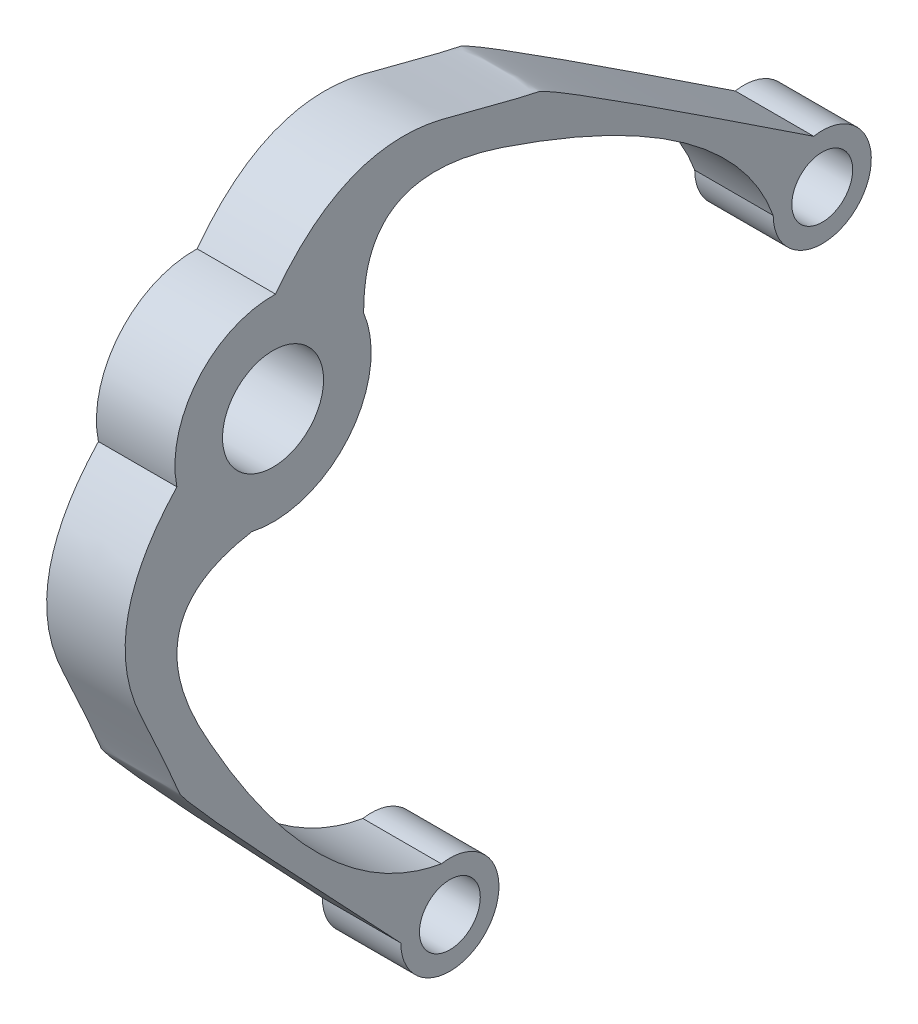
ISO-10303-21;
HEADER;
FILE_DESCRIPTION(('STEP AP214'),'2;1');
FILE_NAME('part.step','',(''),(''),'','','');
FILE_SCHEMA(('AUTOMOTIVE_DESIGN { 1 0 10303 214 1 1 1 1 }'));
ENDSEC;
DATA;
#1=APPLICATION_CONTEXT('core data for automotive mechanical design processes');
#2=APPLICATION_PROTOCOL_DEFINITION('international standard','automotive_design',2000,#1);
#3=PRODUCT_CONTEXT('',#1,'mechanical');
#4=PRODUCT('Part','Part','',(#3));
#5=PRODUCT_RELATED_PRODUCT_CATEGORY('part','',(#4));
#6=PRODUCT_DEFINITION_FORMATION('','',#4);
#7=PRODUCT_DEFINITION_CONTEXT('part definition',#1,'design');
#8=PRODUCT_DEFINITION('design','',#6,#7);
#9=PRODUCT_DEFINITION_SHAPE('','',#8);
#10=(LENGTH_UNIT() NAMED_UNIT(*) SI_UNIT(.MILLI.,.METRE.));
#11=(NAMED_UNIT(*) PLANE_ANGLE_UNIT() SI_UNIT($,.RADIAN.));
#12=(NAMED_UNIT(*) SI_UNIT($,.STERADIAN.) SOLID_ANGLE_UNIT());
#13=UNCERTAINTY_MEASURE_WITH_UNIT(LENGTH_MEASURE(1.E-05),#10,'distance_accuracy_value','');
#14=(GEOMETRIC_REPRESENTATION_CONTEXT(3) GLOBAL_UNCERTAINTY_ASSIGNED_CONTEXT((#13)) GLOBAL_UNIT_ASSIGNED_CONTEXT((#10,
#11,#12)) REPRESENTATION_CONTEXT('',''));
#15=CARTESIAN_POINT('',(0.,0.,0.));
#16=DIRECTION('',(0.,0.,1.));
#17=DIRECTION('',(1.,0.,0.));
#18=AXIS2_PLACEMENT_3D('',#15,#16,#17);
#19=CARTESIAN_POINT('',(4.,0.,0.));
#20=DIRECTION('',(-1.,0.,0.));
#21=DIRECTION('',(0.,0.,1.));
#22=AXIS2_PLACEMENT_3D('',#19,#20,#21);
#23=CYLINDRICAL_SURFACE('',#22,5.);
#24=DIRECTION('',(-1.,0.,0.));
#25=VECTOR('',#24,1.);
#26=CARTESIAN_POINT('',(4.,1.91370313241745,-4.61927919928809));
#27=LINE('',#26,#25);
#28=CARTESIAN_POINT('',(4.,1.91370313241745,-4.61927919928809));
#29=VERTEX_POINT('',#28);
#30=CARTESIAN_POINT('',(0.,1.91370313241745,-4.61927919928809));
#31=VERTEX_POINT('',#30);
#32=EDGE_CURVE('E234',#29,#31,#27,.T.);
#33=ORIENTED_EDGE('',*,*,#32,.F.);
#34=CARTESIAN_POINT('',(4.,0.,0.));
#35=DIRECTION('',(1.,0.,0.));
#36=DIRECTION('',(0.,0.,-1.));
#37=AXIS2_PLACEMENT_3D('',#34,#35,#36);
#38=CIRCLE('',#37,5.);
#39=CARTESIAN_POINT('',(4.,-4.88160145476072,1.08165023777469));
#40=VERTEX_POINT('',#39);
#41=EDGE_CURVE('E52',#40,#29,#38,.T.);
#42=ORIENTED_EDGE('',*,*,#41,.F.);
#43=DIRECTION('',(-1.,0.,0.));
#44=VECTOR('',#43,1.);
#45=CARTESIAN_POINT('',(4.,-4.88160145476072,1.08165023777469));
#46=LINE('',#45,#44);
#47=CARTESIAN_POINT('',(0.,-4.88160145476072,1.08165023777469));
#48=VERTEX_POINT('',#47);
#49=EDGE_CURVE('E427',#40,#48,#46,.T.);
#50=ORIENTED_EDGE('',*,*,#49,.T.);
#51=CARTESIAN_POINT('',(0.,0.,0.));
#52=DIRECTION('',(1.,0.,0.));
#53=DIRECTION('',(0.,0.,-1.));
#54=AXIS2_PLACEMENT_3D('',#51,#52,#53);
#55=CIRCLE('',#54,5.);
#56=EDGE_CURVE('E247',#48,#31,#55,.T.);
#57=ORIENTED_EDGE('',*,*,#56,.T.);
#58=EDGE_LOOP('',(#33,#42,#50,#57));
#59=FACE_BOUND('',#58,.T.);
#60=ADVANCED_FACE('F42',(#59),#23,.T.);
#61=CARTESIAN_POINT('',(4.,0.,0.));
#62=DIRECTION('',(1.,0.,0.));
#63=DIRECTION('',(0.,0.,-1.));
#64=AXIS2_PLACEMENT_3D('',#61,#62,#63);
#65=PLANE('',#64);
#66=CARTESIAN_POINT('',(4.,4.99836423231631,-0.127886672882471));
#67=VERTEX_POINT('',#66);
#68=CARTESIAN_POINT('',(4.,-0.994753899642719,4.90004741600993));
#69=VERTEX_POINT('',#68);
#70=EDGE_CURVE('E11',#67,#69,#38,.T.);
#71=ORIENTED_EDGE('',*,*,#70,.T.);
#72=CARTESIAN_POINT('',(4.,-26.8315889406303,-6.51178854612726));
#73=CARTESIAN_POINT('',(4.,-15.2290963006331,4.52633564030782));
#74=CARTESIAN_POINT('',(4.,-13.8179530887985,5.05001310155712));
#75=CARTESIAN_POINT('',(4.,-5.36192277327116,8.97966757300983));
#76=CARTESIAN_POINT('',(4.,-0.994753899642723,4.90004741600993));
#77=B_SPLINE_CURVE_WITH_KNOTS('',2,(#72,#73,#74,#75,#76),.UNSPECIFIED.,.F.,.F.,(3,1,1,3),(0.,
0.266874259290428,0.583686931850672,1.),.UNSPECIFIED.);
#78=CARTESIAN_POINT('',(4.,-26.8315889406303,-6.51178854612727));
#79=VERTEX_POINT('',#78);
#80=EDGE_CURVE('E136',#79,#69,#77,.T.);
#81=ORIENTED_EDGE('',*,*,#80,.F.);
#82=CARTESIAN_POINT('',(4.,-26.8315889406304,-9.01178854612727));
#83=DIRECTION('',(-1.,0.,0.));
#84=DIRECTION('',(0.,0.,-1.));
#85=AXIS2_PLACEMENT_3D('',#82,#83,#84);
#86=CIRCLE('',#85,2.5);
#87=CARTESIAN_POINT('',(4.,-24.3696451898903,-8.57723939103412));
#88=VERTEX_POINT('',#87);
#89=EDGE_CURVE('E114',#88,#79,#86,.T.);
#90=ORIENTED_EDGE('',*,*,#89,.F.);
#91=CARTESIAN_POINT('',(4.,-4.88160145476072,1.08165023777469));
#92=CARTESIAN_POINT('',(4.,-5.90310291285958,7.19587697461945));
#93=CARTESIAN_POINT('',(4.,-23.3016006741901,-2.35303446189858));
#94=CARTESIAN_POINT('',(4.,-24.3696451898903,-8.57723939103412));
#95=B_SPLINE_CURVE_WITH_KNOTS('',2,(#91,#92,#93,#94),.UNSPECIFIED.,.F.,.F.,(3,1,3),(0.,
0.386205631183094,1.),.UNSPECIFIED.);
#96=EDGE_CURVE('E141',#40,#88,#95,.T.);
#97=ORIENTED_EDGE('',*,*,#96,.F.);
#98=ORIENTED_EDGE('',*,*,#41,.T.);
#99=CARTESIAN_POINT('',(4.,-4.21074887606834,-25.4895711253631));
#100=CARTESIAN_POINT('',(4.,1.73306095861607,-23.3558957197539));
#101=CARTESIAN_POINT('',(4.,8.11241309278775,-4.56245802672587));
#102=CARTESIAN_POINT('',(4.,1.91370313241745,-4.61927919928809));
#103=B_SPLINE_CURVE_WITH_KNOTS('',2,(#99,#100,#101,#102),.UNSPECIFIED.,.F.,.F.,(3,1,3),(0.,
0.613794368816906,1.),.UNSPECIFIED.);
#104=CARTESIAN_POINT('',(4.,-4.21074887606834,-25.4895711253631));
#105=VERTEX_POINT('',#104);
#106=EDGE_CURVE('E193',#105,#29,#103,.T.);
#107=ORIENTED_EDGE('',*,*,#106,.F.);
#108=CARTESIAN_POINT('',(4.,-4.21074887606834,-27.9895711253631));
#109=DIRECTION('',(-1.,0.,0.));
#110=DIRECTION('',(0.,0.,1.));
#111=AXIS2_PLACEMENT_3D('',#108,#109,#110);
#112=CIRCLE('',#111,2.5);
#113=CARTESIAN_POINT('',(4.,-1.74880512532834,-27.5550219702698));
#114=VERTEX_POINT('',#113);
#115=EDGE_CURVE('E202',#114,#105,#112,.T.);
#116=ORIENTED_EDGE('',*,*,#115,.F.);
#117=CARTESIAN_POINT('',(4.,4.99836423231631,-0.127886672882471));
#118=CARTESIAN_POINT('',(4.,9.77498219035762,-3.7194581226947));
#119=CARTESIAN_POINT('',(4.,7.37497121455518,-12.7298177313981));
#120=CARTESIAN_POINT('',(4.,7.10454986947199,-14.2105052554391));
#121=CARTESIAN_POINT('',(4.,-1.74880512532834,-27.5550219702698));
#122=B_SPLINE_CURVE_WITH_KNOTS('',2,(#117,#118,#119,#120,#121),.UNSPECIFIED.,.F.,.F.,(3,1,1,3),
(0.,0.416313068149328,0.733125740709572,1.),.UNSPECIFIED.);
#123=EDGE_CURVE('E226',#67,#114,#122,.T.);
#124=ORIENTED_EDGE('',*,*,#123,.F.);
#125=EDGE_LOOP('',(#71,#81,#90,#97,#98,#107,#116,#124));
#126=FACE_BOUND('',#125,.T.);
#127=CARTESIAN_POINT('',(4.,0.,0.));
#128=DIRECTION('',(1.,0.,0.));
#129=DIRECTION('',(0.,0.,-1.));
#130=AXIS2_PLACEMENT_3D('',#127,#128,#129);
#131=CIRCLE('',#130,2.575);
#132=CARTESIAN_POINT('',(4.,0.,-2.575));
#133=VERTEX_POINT('',#132);
#134=EDGE_CURVE('E243',#133,#133,#131,.T.);
#135=ORIENTED_EDGE('',*,*,#134,.F.);
#136=EDGE_LOOP('',(#135));
#137=FACE_BOUND('',#136,.T.);
#138=CARTESIAN_POINT('',(4.,-4.21074887606834,-27.9895711253631));
#139=DIRECTION('',(-1.,0.,0.));
#140=DIRECTION('',(0.,0.,1.));
#141=AXIS2_PLACEMENT_3D('',#138,#139,#140);
#142=CIRCLE('',#141,1.55000000001448);
#143=CARTESIAN_POINT('',(4.,-4.21074887606834,-26.4395711253486));
#144=VERTEX_POINT('',#143);
#145=EDGE_CURVE('E214',#144,#144,#142,.T.);
#146=ORIENTED_EDGE('',*,*,#145,.T.);
#147=EDGE_LOOP('',(#146));
#148=FACE_BOUND('',#147,.T.);
#149=CARTESIAN_POINT('',(4.,-26.8315889406304,-9.01178854612727));
#150=DIRECTION('',(-1.,0.,0.));
#151=DIRECTION('',(0.,0.,-1.));
#152=AXIS2_PLACEMENT_3D('',#149,#150,#151);
#153=CIRCLE('',#152,1.54999999999715);
#154=CARTESIAN_POINT('',(4.,-26.8315889406304,-10.5617885461244));
#155=VERTEX_POINT('',#154);
#156=EDGE_CURVE('E127',#155,#155,#153,.T.);
#157=ORIENTED_EDGE('',*,*,#156,.T.);
#158=EDGE_LOOP('',(#157));
#159=FACE_BOUND('',#158,.T.);
#160=ADVANCED_FACE('F264',(#126,#137,#148,#159),#65,.T.);
#161=CARTESIAN_POINT('',(0.,0.,0.));
#162=DIRECTION('',(1.,0.,0.));
#163=DIRECTION('',(0.,0.,-1.));
#164=AXIS2_PLACEMENT_3D('',#161,#162,#163);
#165=PLANE('',#164);
#166=CARTESIAN_POINT('',(0.,-4.21074887606834,-25.4895711253631));
#167=CARTESIAN_POINT('',(0.,1.73306095861607,-23.3558957197539));
#168=CARTESIAN_POINT('',(0.,8.11241309278775,-4.56245802672587));
#169=CARTESIAN_POINT('',(0.,1.91370313241745,-4.61927919928809));
#170=B_SPLINE_CURVE_WITH_KNOTS('',2,(#166,#167,#168,#169),.UNSPECIFIED.,.F.,.F.,(3,1,3),(0.,
0.613794368816906,1.),.UNSPECIFIED.);
#171=CARTESIAN_POINT('',(0.,-4.21074887606834,-25.4895711253631));
#172=VERTEX_POINT('',#171);
#173=EDGE_CURVE('E221',#172,#31,#170,.T.);
#174=ORIENTED_EDGE('',*,*,#173,.T.);
#175=ORIENTED_EDGE('',*,*,#56,.F.);
#176=CARTESIAN_POINT('',(0.,-4.88160145476072,1.08165023777469));
#177=CARTESIAN_POINT('',(0.,-5.90310291285958,7.19587697461945));
#178=CARTESIAN_POINT('',(0.,-23.3016006741901,-2.35303446189858));
#179=CARTESIAN_POINT('',(0.,-24.3696451898903,-8.57723939103412));
#180=B_SPLINE_CURVE_WITH_KNOTS('',2,(#176,#177,#178,#179),.UNSPECIFIED.,.F.,.F.,(3,1,3),(0.,
0.386205631183094,1.),.UNSPECIFIED.);
#181=CARTESIAN_POINT('',(0.,-24.3696451898903,-8.57723939103412));
#182=VERTEX_POINT('',#181);
#183=EDGE_CURVE('E128',#48,#182,#180,.T.);
#184=ORIENTED_EDGE('',*,*,#183,.T.);
#185=CARTESIAN_POINT('',(0.,-26.8315889406304,-9.01178854612727));
#186=DIRECTION('',(-1.,0.,0.));
#187=DIRECTION('',(0.,0.,-1.));
#188=AXIS2_PLACEMENT_3D('',#185,#186,#187);
#189=CIRCLE('',#188,2.5);
#190=CARTESIAN_POINT('',(0.,-26.8315889406303,-6.51178854612727));
#191=VERTEX_POINT('',#190);
#192=EDGE_CURVE('E112',#182,#191,#189,.T.);
#193=ORIENTED_EDGE('',*,*,#192,.T.);
#194=CARTESIAN_POINT('',(0.,-26.8315889406303,-6.51178854612726));
#195=CARTESIAN_POINT('',(0.,-15.2290963006331,4.52633564030782));
#196=CARTESIAN_POINT('',(0.,-13.8179530887985,5.05001310155712));
#197=CARTESIAN_POINT('',(0.,-5.36192277327116,8.97966757300983));
#198=CARTESIAN_POINT('',(0.,-0.994753899642723,4.90004741600993));
#199=B_SPLINE_CURVE_WITH_KNOTS('',2,(#194,#195,#196,#197,#198),.UNSPECIFIED.,.F.,.F.,(3,1,1,3),
(0.,0.266874259290428,0.583686931850672,1.),.UNSPECIFIED.);
#200=CARTESIAN_POINT('',(0.,-0.994753899642719,4.90004741600993));
#201=VERTEX_POINT('',#200);
#202=EDGE_CURVE('E122',#191,#201,#199,.T.);
#203=ORIENTED_EDGE('',*,*,#202,.T.);
#204=CARTESIAN_POINT('',(0.,4.99836423231631,-0.127886672882471));
#205=VERTEX_POINT('',#204);
#206=EDGE_CURVE('E46',#205,#201,#55,.T.);
#207=ORIENTED_EDGE('',*,*,#206,.F.);
#208=CARTESIAN_POINT('',(0.,4.99836423231631,-0.127886672882471));
#209=CARTESIAN_POINT('',(0.,9.77498219035762,-3.7194581226947));
#210=CARTESIAN_POINT('',(0.,7.37497121455518,-12.7298177313981));
#211=CARTESIAN_POINT('',(0.,7.10454986947199,-14.2105052554391));
#212=CARTESIAN_POINT('',(0.,-1.74880512532834,-27.5550219702698));
#213=B_SPLINE_CURVE_WITH_KNOTS('',2,(#208,#209,#210,#211,#212),.UNSPECIFIED.,.F.,.F.,(3,1,1,3),
(0.,0.416313068149328,0.733125740709572,1.),.UNSPECIFIED.);
#214=CARTESIAN_POINT('',(0.,-1.74880512532834,-27.5550219702698));
#215=VERTEX_POINT('',#214);
#216=EDGE_CURVE('E204',#205,#215,#213,.T.);
#217=ORIENTED_EDGE('',*,*,#216,.T.);
#218=CARTESIAN_POINT('',(0.,-4.21074887606834,-27.9895711253631));
#219=DIRECTION('',(-1.,0.,0.));
#220=DIRECTION('',(0.,0.,1.));
#221=AXIS2_PLACEMENT_3D('',#218,#219,#220);
#222=CIRCLE('',#221,2.5);
#223=EDGE_CURVE('E213',#215,#172,#222,.T.);
#224=ORIENTED_EDGE('',*,*,#223,.T.);
#225=EDGE_LOOP('',(#174,#175,#184,#193,#203,#207,#217,#224));
#226=FACE_BOUND('',#225,.T.);
#227=CARTESIAN_POINT('',(0.,0.,0.));
#228=DIRECTION('',(1.,0.,0.));
#229=DIRECTION('',(0.,0.,-1.));
#230=AXIS2_PLACEMENT_3D('',#227,#228,#229);
#231=CIRCLE('',#230,2.575);
#232=CARTESIAN_POINT('',(0.,0.,-2.575));
#233=VERTEX_POINT('',#232);
#234=EDGE_CURVE('E233',#233,#233,#231,.T.);
#235=ORIENTED_EDGE('',*,*,#234,.T.);
#236=EDGE_LOOP('',(#235));
#237=FACE_BOUND('',#236,.T.);
#238=CARTESIAN_POINT('',(0.,-4.21074887606834,-27.9895711253631));
#239=DIRECTION('',(-1.,0.,0.));
#240=DIRECTION('',(0.,0.,1.));
#241=AXIS2_PLACEMENT_3D('',#238,#239,#240);
#242=CIRCLE('',#241,1.55000000001448);
#243=CARTESIAN_POINT('',(0.,-4.21074887606834,-26.4395711253486));
#244=VERTEX_POINT('',#243);
#245=EDGE_CURVE('E286',#244,#244,#242,.T.);
#246=ORIENTED_EDGE('',*,*,#245,.F.);
#247=EDGE_LOOP('',(#246));
#248=FACE_BOUND('',#247,.T.);
#249=CARTESIAN_POINT('',(0.,-26.8315889406304,-9.01178854612727));
#250=DIRECTION('',(-1.,0.,0.));
#251=DIRECTION('',(0.,0.,-1.));
#252=AXIS2_PLACEMENT_3D('',#249,#250,#251);
#253=CIRCLE('',#252,1.54999999999715);
#254=CARTESIAN_POINT('',(0.,-26.8315889406304,-10.5617885461244));
#255=VERTEX_POINT('',#254);
#256=EDGE_CURVE('E293',#255,#255,#253,.T.);
#257=ORIENTED_EDGE('',*,*,#256,.F.);
#258=EDGE_LOOP('',(#257));
#259=FACE_BOUND('',#258,.T.);
#260=ADVANCED_FACE('F132',(#226,#237,#248,#259),#165,.F.);
#261=ORIENTED_EDGE('',*,*,#206,.T.);
#262=DIRECTION('',(-1.,0.,0.));
#263=VECTOR('',#262,1.);
#264=CARTESIAN_POINT('',(4.,-0.994753899642722,4.90004741600993));
#265=LINE('',#264,#263);
#266=EDGE_CURVE('E124',#69,#201,#265,.T.);
#267=ORIENTED_EDGE('',*,*,#266,.F.);
#268=ORIENTED_EDGE('',*,*,#70,.F.);
#269=DIRECTION('',(-1.,0.,0.));
#270=VECTOR('',#269,1.);
#271=CARTESIAN_POINT('',(4.,4.99836423231631,-0.127886672882471));
#272=LINE('',#271,#270);
#273=EDGE_CURVE('E227',#67,#205,#272,.T.);
#274=ORIENTED_EDGE('',*,*,#273,.T.);
#275=EDGE_LOOP('',(#261,#267,#268,#274));
#276=FACE_BOUND('',#275,.T.);
#277=ADVANCED_FACE('F44',(#276),#23,.T.);
#278=CARTESIAN_POINT('',(4.,0.,0.));
#279=DIRECTION('',(-1.,0.,0.));
#280=DIRECTION('',(0.,0.,1.));
#281=AXIS2_PLACEMENT_3D('',#278,#279,#280);
#282=CYLINDRICAL_SURFACE('',#281,2.575);
#283=ORIENTED_EDGE('',*,*,#134,.T.);
#284=EDGE_LOOP('',(#283));
#285=FACE_BOUND('',#284,.T.);
#286=ORIENTED_EDGE('',*,*,#234,.F.);
#287=EDGE_LOOP('',(#286));
#288=FACE_BOUND('',#287,.T.);
#289=ADVANCED_FACE('F253',(#285,#288),#282,.F.);
#290=DIRECTION('',(-1.,0.,0.));
#291=VECTOR('',#290,1.);
#292=SURFACE_OF_LINEAR_EXTRUSION('',#122,#291);
#293=ORIENTED_EDGE('',*,*,#216,.F.);
#294=ORIENTED_EDGE('',*,*,#273,.F.);
#295=ORIENTED_EDGE('',*,*,#123,.T.);
#296=DIRECTION('',(-1.,0.,0.));
#297=VECTOR('',#296,1.);
#298=CARTESIAN_POINT('',(4.,-1.74880512532834,-27.5550219702698));
#299=LINE('',#298,#297);
#300=EDGE_CURVE('E201',#114,#215,#299,.T.);
#301=ORIENTED_EDGE('',*,*,#300,.T.);
#302=EDGE_LOOP('',(#293,#294,#295,#301));
#303=FACE_BOUND('',#302,.T.);
#304=ADVANCED_FACE('F190',(#303),#292,.T.);
#305=DIRECTION('',(-1.,0.,0.));
#306=VECTOR('',#305,1.);
#307=SURFACE_OF_LINEAR_EXTRUSION('',#103,#306);
#308=ORIENTED_EDGE('',*,*,#173,.F.);
#309=DIRECTION('',(-1.,0.,0.));
#310=VECTOR('',#309,1.);
#311=CARTESIAN_POINT('',(4.,-4.21074887606834,-25.4895711253631));
#312=LINE('',#311,#310);
#313=EDGE_CURVE('E238',#105,#172,#312,.T.);
#314=ORIENTED_EDGE('',*,*,#313,.F.);
#315=ORIENTED_EDGE('',*,*,#106,.T.);
#316=ORIENTED_EDGE('',*,*,#32,.T.);
#317=EDGE_LOOP('',(#308,#314,#315,#316));
#318=FACE_BOUND('',#317,.T.);
#319=ADVANCED_FACE('F186',(#318),#307,.T.);
#320=CARTESIAN_POINT('',(4.,-4.21074887606834,-27.9895711253631));
#321=DIRECTION('',(-1.,0.,0.));
#322=DIRECTION('',(0.,0.,1.));
#323=AXIS2_PLACEMENT_3D('',#320,#321,#322);
#324=CYLINDRICAL_SURFACE('',#323,2.5);
#325=ORIENTED_EDGE('',*,*,#223,.F.);
#326=ORIENTED_EDGE('',*,*,#300,.F.);
#327=ORIENTED_EDGE('',*,*,#115,.T.);
#328=ORIENTED_EDGE('',*,*,#313,.T.);
#329=EDGE_LOOP('',(#325,#326,#327,#328));
#330=FACE_BOUND('',#329,.T.);
#331=ADVANCED_FACE('F184',(#330),#324,.T.);
#332=CARTESIAN_POINT('',(4.,-4.21074887606834,-27.9895711253631));
#333=DIRECTION('',(-1.,0.,0.));
#334=DIRECTION('',(0.,0.,1.));
#335=AXIS2_PLACEMENT_3D('',#332,#333,#334);
#336=CYLINDRICAL_SURFACE('',#335,1.55000000001448);
#337=ORIENTED_EDGE('',*,*,#145,.F.);
#338=EDGE_LOOP('',(#337));
#339=FACE_BOUND('',#338,.T.);
#340=ORIENTED_EDGE('',*,*,#245,.T.);
#341=EDGE_LOOP('',(#340));
#342=FACE_BOUND('',#341,.T.);
#343=ADVANCED_FACE('F181',(#339,#342),#336,.F.);
#344=DIRECTION('',(-1.,0.,0.));
#345=VECTOR('',#344,1.);
#346=SURFACE_OF_LINEAR_EXTRUSION('',#77,#345);
#347=ORIENTED_EDGE('',*,*,#202,.F.);
#348=DIRECTION('',(-1.,0.,0.));
#349=VECTOR('',#348,1.);
#350=CARTESIAN_POINT('',(4.,-26.8315889406303,-6.51178854612727));
#351=LINE('',#350,#349);
#352=EDGE_CURVE('E108',#79,#191,#351,.T.);
#353=ORIENTED_EDGE('',*,*,#352,.F.);
#354=ORIENTED_EDGE('',*,*,#80,.T.);
#355=ORIENTED_EDGE('',*,*,#266,.T.);
#356=EDGE_LOOP('',(#347,#353,#354,#355));
#357=FACE_BOUND('',#356,.T.);
#358=ADVANCED_FACE('F123',(#357),#346,.T.);
#359=CARTESIAN_POINT('',(4.,-26.8315889406304,-9.01178854612727));
#360=DIRECTION('',(-1.,0.,0.));
#361=DIRECTION('',(0.,0.,1.));
#362=AXIS2_PLACEMENT_3D('',#359,#360,#361);
#363=CYLINDRICAL_SURFACE('',#362,2.5);
#364=ORIENTED_EDGE('',*,*,#192,.F.);
#365=DIRECTION('',(-1.,0.,0.));
#366=VECTOR('',#365,1.);
#367=CARTESIAN_POINT('',(4.,-24.3696451898903,-8.57723939103412));
#368=LINE('',#367,#366);
#369=EDGE_CURVE('E119',#88,#182,#368,.T.);
#370=ORIENTED_EDGE('',*,*,#369,.F.);
#371=ORIENTED_EDGE('',*,*,#89,.T.);
#372=ORIENTED_EDGE('',*,*,#352,.T.);
#373=EDGE_LOOP('',(#364,#370,#371,#372));
#374=FACE_BOUND('',#373,.T.);
#375=ADVANCED_FACE('F110',(#374),#363,.T.);
#376=DIRECTION('',(-1.,0.,0.));
#377=VECTOR('',#376,1.);
#378=SURFACE_OF_LINEAR_EXTRUSION('',#95,#377);
#379=ORIENTED_EDGE('',*,*,#183,.F.);
#380=ORIENTED_EDGE('',*,*,#49,.F.);
#381=ORIENTED_EDGE('',*,*,#96,.T.);
#382=ORIENTED_EDGE('',*,*,#369,.T.);
#383=EDGE_LOOP('',(#379,#380,#381,#382));
#384=FACE_BOUND('',#383,.T.);
#385=ADVANCED_FACE('F170',(#384),#378,.T.);
#386=CARTESIAN_POINT('',(4.,-26.8315889406304,-9.01178854612727));
#387=DIRECTION('',(-1.,0.,0.));
#388=DIRECTION('',(0.,0.,1.));
#389=AXIS2_PLACEMENT_3D('',#386,#387,#388);
#390=CYLINDRICAL_SURFACE('',#389,1.54999999999715);
#391=ORIENTED_EDGE('',*,*,#156,.F.);
#392=EDGE_LOOP('',(#391));
#393=FACE_BOUND('',#392,.T.);
#394=ORIENTED_EDGE('',*,*,#256,.T.);
#395=EDGE_LOOP('',(#394));
#396=FACE_BOUND('',#395,.T.);
#397=ADVANCED_FACE('F174',(#393,#396),#390,.F.);
#398=CLOSED_SHELL('',(#60,#160,#260,#277,#289,#304,#319,#331,#343,#358,#375,#385,#397));
#399=MANIFOLD_SOLID_BREP('B2',#398);
#400=ADVANCED_BREP_SHAPE_REPRESENTATION('',(#18,#399),#14);
#401=SHAPE_DEFINITION_REPRESENTATION(#9,#400);
ENDSEC;
END-ISO-10303-21;
